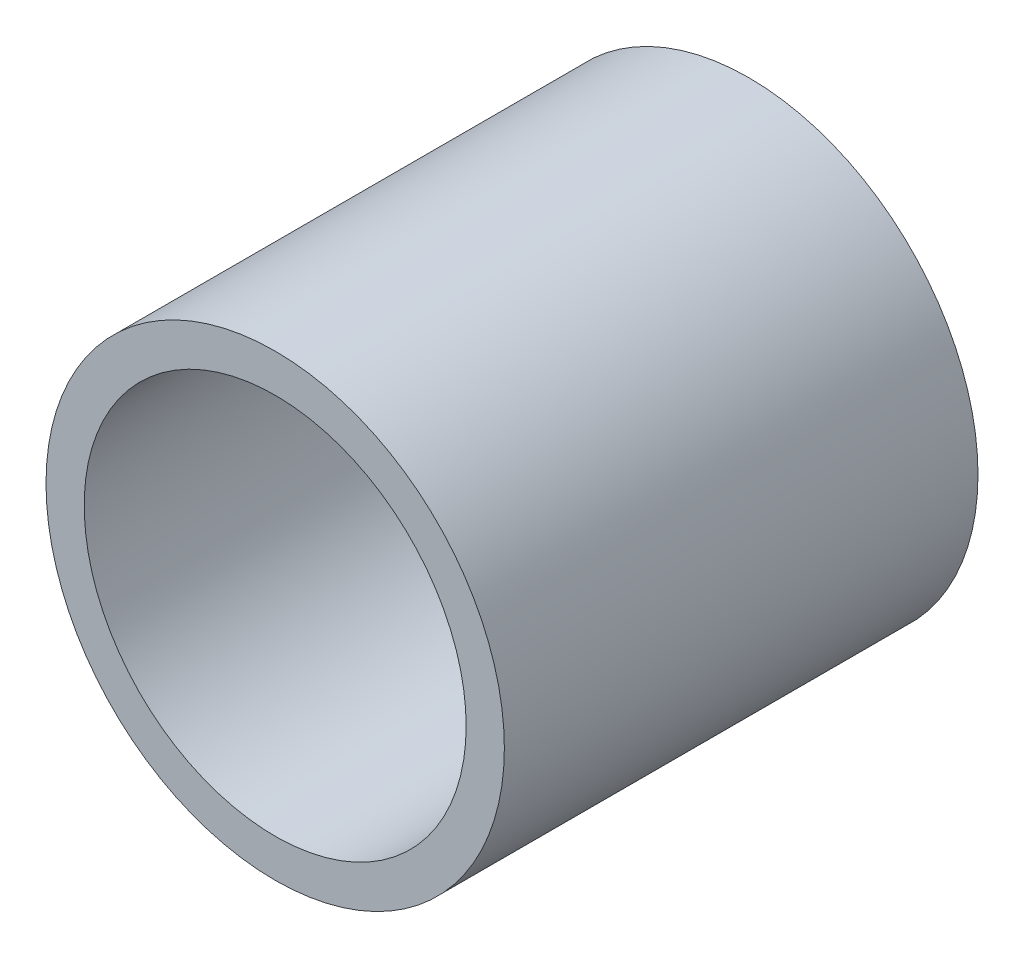
ISO-10303-21;
HEADER;
FILE_DESCRIPTION(('STEP AP214'),'2;1');
FILE_NAME('part.step','',(''),(''),'','','');
FILE_SCHEMA(('AUTOMOTIVE_DESIGN { 1 0 10303 214 1 1 1 1 }'));
ENDSEC;
DATA;
#1=APPLICATION_CONTEXT('core data for automotive mechanical design processes');
#2=APPLICATION_PROTOCOL_DEFINITION('international standard','automotive_design',2000,#1);
#3=PRODUCT_CONTEXT('',#1,'mechanical');
#4=PRODUCT('Part','Part','',(#3));
#5=PRODUCT_RELATED_PRODUCT_CATEGORY('part','',(#4));
#6=PRODUCT_DEFINITION_FORMATION('','',#4);
#7=PRODUCT_DEFINITION_CONTEXT('part definition',#1,'design');
#8=PRODUCT_DEFINITION('design','',#6,#7);
#9=PRODUCT_DEFINITION_SHAPE('','',#8);
#10=(LENGTH_UNIT() NAMED_UNIT(*) SI_UNIT(.MILLI.,.METRE.));
#11=(NAMED_UNIT(*) PLANE_ANGLE_UNIT() SI_UNIT($,.RADIAN.));
#12=(NAMED_UNIT(*) SI_UNIT($,.STERADIAN.) SOLID_ANGLE_UNIT());
#13=UNCERTAINTY_MEASURE_WITH_UNIT(LENGTH_MEASURE(1.E-05),#10,'distance_accuracy_value','');
#14=(GEOMETRIC_REPRESENTATION_CONTEXT(3) GLOBAL_UNCERTAINTY_ASSIGNED_CONTEXT((#13)) GLOBAL_UNIT_ASSIGNED_CONTEXT((#10,
#11,#12)) REPRESENTATION_CONTEXT('',''));
#15=CARTESIAN_POINT('',(0.,0.,0.));
#16=DIRECTION('',(0.,0.,1.));
#17=DIRECTION('',(1.,0.,0.));
#18=AXIS2_PLACEMENT_3D('',#15,#16,#17);
#19=CARTESIAN_POINT('',(0.,0.,31.));
#20=DIRECTION('',(0.,0.,1.));
#21=DIRECTION('',(1.,0.,0.));
#22=AXIS2_PLACEMENT_3D('',#19,#20,#21);
#23=PLANE('',#22);
#24=CARTESIAN_POINT('',(0.,0.,31.));
#25=DIRECTION('',(0.,0.,1.));
#26=DIRECTION('',(1.,0.,0.));
#27=AXIS2_PLACEMENT_3D('',#24,#25,#26);
#28=CIRCLE('',#27,15.);
#29=CARTESIAN_POINT('',(15.,0.,31.));
#30=VERTEX_POINT('',#29);
#31=EDGE_CURVE('E10',#30,#30,#28,.T.);
#32=ORIENTED_EDGE('',*,*,#31,.T.);
#33=EDGE_LOOP('',(#32));
#34=FACE_BOUND('',#33,.T.);
#35=CARTESIAN_POINT('',(0.,0.,31.));
#36=DIRECTION('',(0.,0.,1.));
#37=DIRECTION('',(1.,0.,0.));
#38=AXIS2_PLACEMENT_3D('',#35,#36,#37);
#39=CIRCLE('',#38,12.5);
#40=CARTESIAN_POINT('',(12.5,0.,31.));
#41=VERTEX_POINT('',#40);
#42=EDGE_CURVE('E46',#41,#41,#39,.T.);
#43=ORIENTED_EDGE('',*,*,#42,.F.);
#44=EDGE_LOOP('',(#43));
#45=FACE_BOUND('',#44,.T.);
#46=ADVANCED_FACE('F35',(#34,#45),#23,.T.);
#47=CARTESIAN_POINT('',(0.,0.,0.));
#48=DIRECTION('',(0.,0.,1.));
#49=DIRECTION('',(1.,0.,0.));
#50=AXIS2_PLACEMENT_3D('',#47,#48,#49);
#51=PLANE('',#50);
#52=CARTESIAN_POINT('',(0.,0.,0.));
#53=DIRECTION('',(0.,0.,1.));
#54=DIRECTION('',(1.,0.,0.));
#55=AXIS2_PLACEMENT_3D('',#52,#53,#54);
#56=CIRCLE('',#55,15.);
#57=CARTESIAN_POINT('',(15.,0.,0.));
#58=VERTEX_POINT('',#57);
#59=EDGE_CURVE('E39',#58,#58,#56,.T.);
#60=ORIENTED_EDGE('',*,*,#59,.F.);
#61=EDGE_LOOP('',(#60));
#62=FACE_BOUND('',#61,.T.);
#63=CARTESIAN_POINT('',(0.,0.,0.));
#64=DIRECTION('',(0.,0.,1.));
#65=DIRECTION('',(1.,0.,0.));
#66=AXIS2_PLACEMENT_3D('',#63,#64,#65);
#67=CIRCLE('',#66,12.5);
#68=CARTESIAN_POINT('',(12.5,0.,0.));
#69=VERTEX_POINT('',#68);
#70=EDGE_CURVE('E48',#69,#69,#67,.T.);
#71=ORIENTED_EDGE('',*,*,#70,.T.);
#72=EDGE_LOOP('',(#71));
#73=FACE_BOUND('',#72,.T.);
#74=ADVANCED_FACE('F58',(#62,#73),#51,.F.);
#75=CARTESIAN_POINT('',(0.,0.,31.));
#76=DIRECTION('',(0.,0.,-1.));
#77=DIRECTION('',(-1.,0.,0.));
#78=AXIS2_PLACEMENT_3D('',#75,#76,#77);
#79=CYLINDRICAL_SURFACE('',#78,15.);
#80=ORIENTED_EDGE('',*,*,#31,.F.);
#81=EDGE_LOOP('',(#80));
#82=FACE_BOUND('',#81,.T.);
#83=ORIENTED_EDGE('',*,*,#59,.T.);
#84=EDGE_LOOP('',(#83));
#85=FACE_BOUND('',#84,.T.);
#86=ADVANCED_FACE('F37',(#82,#85),#79,.T.);
#87=CARTESIAN_POINT('',(0.,0.,31.));
#88=DIRECTION('',(0.,0.,-1.));
#89=DIRECTION('',(-1.,0.,0.));
#90=AXIS2_PLACEMENT_3D('',#87,#88,#89);
#91=CYLINDRICAL_SURFACE('',#90,12.5);
#92=ORIENTED_EDGE('',*,*,#42,.T.);
#93=EDGE_LOOP('',(#92));
#94=FACE_BOUND('',#93,.T.);
#95=ORIENTED_EDGE('',*,*,#70,.F.);
#96=EDGE_LOOP('',(#95));
#97=FACE_BOUND('',#96,.T.);
#98=ADVANCED_FACE('F54',(#94,#97),#91,.F.);
#99=CLOSED_SHELL('',(#46,#74,#86,#98));
#100=MANIFOLD_SOLID_BREP('B2',#99);
#101=ADVANCED_BREP_SHAPE_REPRESENTATION('',(#18,#100),#14);
#102=SHAPE_DEFINITION_REPRESENTATION(#9,#101);
ENDSEC;
END-ISO-10303-21;
